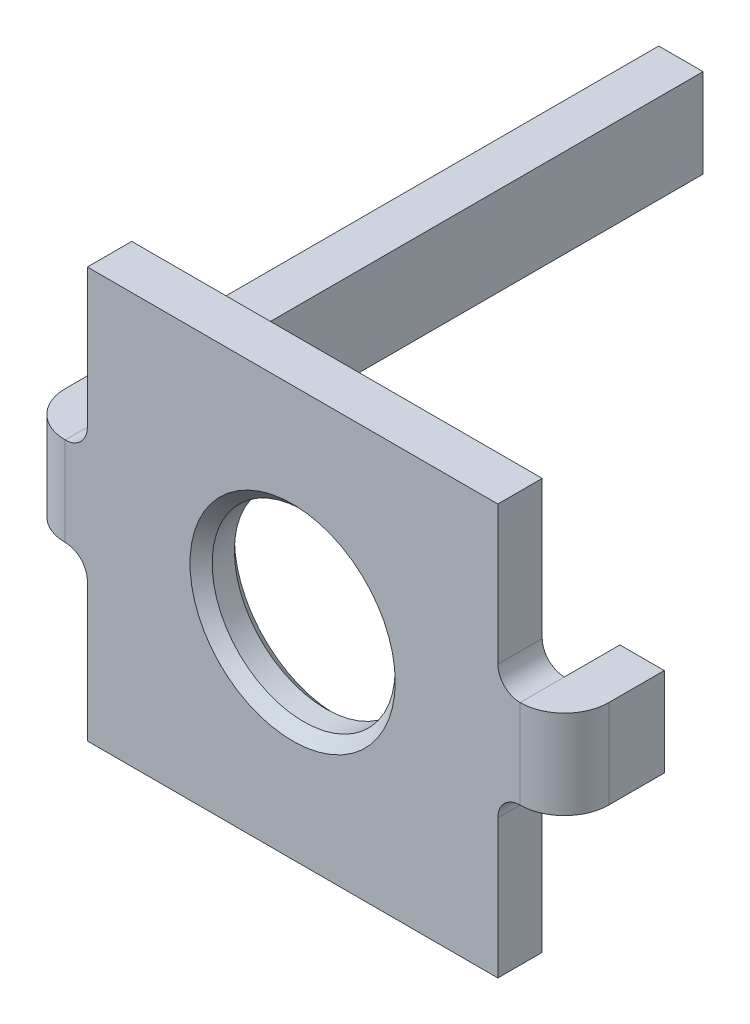
ISO-10303-21;
HEADER;
FILE_DESCRIPTION(('STEP AP214'),'2;1');
FILE_NAME('part.step','',(''),(''),'','','');
FILE_SCHEMA(('AUTOMOTIVE_DESIGN { 1 0 10303 214 1 1 1 1 }'));
ENDSEC;
DATA;
#1=APPLICATION_CONTEXT('core data for automotive mechanical design processes');
#2=APPLICATION_PROTOCOL_DEFINITION('international standard','automotive_design',2000,#1);
#3=PRODUCT_CONTEXT('',#1,'mechanical');
#4=PRODUCT('Part','Part','',(#3));
#5=PRODUCT_RELATED_PRODUCT_CATEGORY('part','',(#4));
#6=PRODUCT_DEFINITION_FORMATION('','',#4);
#7=PRODUCT_DEFINITION_CONTEXT('part definition',#1,'design');
#8=PRODUCT_DEFINITION('design','',#6,#7);
#9=PRODUCT_DEFINITION_SHAPE('','',#8);
#10=(LENGTH_UNIT() NAMED_UNIT(*) SI_UNIT(.MILLI.,.METRE.));
#11=(NAMED_UNIT(*) PLANE_ANGLE_UNIT() SI_UNIT($,.RADIAN.));
#12=(NAMED_UNIT(*) SI_UNIT($,.STERADIAN.) SOLID_ANGLE_UNIT());
#13=UNCERTAINTY_MEASURE_WITH_UNIT(LENGTH_MEASURE(1.E-05),#10,'distance_accuracy_value','');
#14=(GEOMETRIC_REPRESENTATION_CONTEXT(3) GLOBAL_UNCERTAINTY_ASSIGNED_CONTEXT((#13)) GLOBAL_UNIT_ASSIGNED_CONTEXT((#10,
#11,#12)) REPRESENTATION_CONTEXT('',''));
#15=CARTESIAN_POINT('',(0.,0.,0.));
#16=DIRECTION('',(0.,0.,1.));
#17=DIRECTION('',(1.,0.,0.));
#18=AXIS2_PLACEMENT_3D('',#15,#16,#17);
#19=CARTESIAN_POINT('',(85.200000000002,14.205,-2.2));
#20=DIRECTION('',(0.,0.,-1.));
#21=DIRECTION('',(0.,1.,0.));
#22=AXIS2_PLACEMENT_3D('',#19,#20,#21);
#23=PLANE('',#22);
#24=DIRECTION('',(1.,0.,0.));
#25=VECTOR('',#24,1.);
#26=CARTESIAN_POINT('',(84.399999999999,9.7050000000019,-2.2000000000002));
#27=LINE('',#26,#25);
#28=CARTESIAN_POINT('',(84.400000000002,9.70500000000063,-2.20000000000007));
#29=VERTEX_POINT('',#28);
#30=CARTESIAN_POINT('',(85.2000000000015,9.70500000000095,-2.20000000000015));
#31=VERTEX_POINT('',#30);
#32=EDGE_CURVE('E152',#29,#31,#27,.T.);
#33=ORIENTED_EDGE('',*,*,#32,.F.);
#34=DIRECTION('',(0.,1.,0.));
#35=VECTOR('',#34,1.);
#36=CARTESIAN_POINT('',(84.400000000002,14.205,-2.2));
#37=LINE('',#36,#35);
#38=CARTESIAN_POINT('',(84.4000000000013,11.3050000000013,-2.20000000000007));
#39=VERTEX_POINT('',#38);
#40=EDGE_CURVE('E198',#39,#29,#37,.F.);
#41=ORIENTED_EDGE('',*,*,#40,.F.);
#42=DIRECTION('',(1.,0.,0.));
#43=VECTOR('',#42,1.);
#44=CARTESIAN_POINT('',(85.200000000002,11.305,-2.2));
#45=LINE('',#44,#43);
#46=CARTESIAN_POINT('',(85.2000000000013,11.3050000000008,-2.20000000000007));
#47=VERTEX_POINT('',#46);
#48=EDGE_CURVE('E153',#39,#47,#45,.T.);
#49=ORIENTED_EDGE('',*,*,#48,.T.);
#50=DIRECTION('',(0.,1.,0.));
#51=VECTOR('',#50,1.);
#52=CARTESIAN_POINT('',(85.200000000002,14.205,-2.2));
#53=LINE('',#52,#51);
#54=EDGE_CURVE('E193',#31,#47,#53,.T.);
#55=ORIENTED_EDGE('',*,*,#54,.F.);
#56=EDGE_LOOP('',(#33,#41,#49,#55));
#57=FACE_BOUND('',#56,.T.);
#58=ADVANCED_FACE('F17',(#57),#23,.T.);
#59=CARTESIAN_POINT('',(84.399999999999,9.705000000003,5008.5));
#60=DIRECTION('',(0.,-1.,0.));
#61=DIRECTION('',(0.,0.,-1.));
#62=AXIS2_PLACEMENT_3D('',#59,#60,#61);
#63=PLANE('',#62);
#64=DIRECTION('',(0.,0.,-1.));
#65=VECTOR('',#64,1.);
#66=CARTESIAN_POINT('',(85.200000000002,9.705,8.5));
#67=LINE('',#66,#65);
#68=CARTESIAN_POINT('',(85.2000000000015,9.70500000000095,8.49999999999986));
#69=VERTEX_POINT('',#68);
#70=EDGE_CURVE('E177',#69,#31,#67,.T.);
#71=ORIENTED_EDGE('',*,*,#70,.F.);
#72=DIRECTION('',(0.,0.,-1.));
#73=VECTOR('',#72,1.);
#74=CARTESIAN_POINT('',(85.200000000001,9.705000000003,5008.5));
#75=LINE('',#74,#73);
#76=CARTESIAN_POINT('',(85.200000000001,9.70500000000095,9.29999999999982));
#77=VERTEX_POINT('',#76);
#78=EDGE_CURVE('E159',#69,#77,#75,.F.);
#79=ORIENTED_EDGE('',*,*,#78,.T.);
#80=CARTESIAN_POINT('',(85.200000000002,9.705,8.5));
#81=DIRECTION('',(0.,1.,0.));
#82=DIRECTION('',(0.,0.,1.));
#83=AXIS2_PLACEMENT_3D('',#80,#81,#82);
#84=CIRCLE('',#83,0.8);
#85=CARTESIAN_POINT('',(84.400000000002,9.705,8.5));
#86=VERTEX_POINT('',#85);
#87=EDGE_CURVE('E20',#77,#86,#84,.F.);
#88=ORIENTED_EDGE('',*,*,#87,.T.);
#89=DIRECTION('',(0.,0.,1.));
#90=VECTOR('',#89,1.);
#91=CARTESIAN_POINT('',(84.400000000002,9.705,-2.2));
#92=LINE('',#91,#90);
#93=EDGE_CURVE('E262',#29,#86,#92,.T.);
#94=ORIENTED_EDGE('',*,*,#93,.F.);
#95=ORIENTED_EDGE('',*,*,#32,.T.);
#96=EDGE_LOOP('',(#71,#79,#88,#94,#95));
#97=FACE_BOUND('',#96,.T.);
#98=ADVANCED_FACE('F175',(#97),#63,.T.);
#99=CARTESIAN_POINT('',(85.200000000002,14.205,8.5));
#100=DIRECTION('',(1.,0.,0.));
#101=DIRECTION('',(0.,0.,-1.));
#102=AXIS2_PLACEMENT_3D('',#99,#100,#101);
#103=PLANE('',#102);
#104=ORIENTED_EDGE('',*,*,#70,.T.);
#105=ORIENTED_EDGE('',*,*,#54,.T.);
#106=DIRECTION('',(0.,0.,1.));
#107=VECTOR('',#106,1.);
#108=CARTESIAN_POINT('',(85.200000000001,11.305000000003,5008.5));
#109=LINE('',#108,#107);
#110=CARTESIAN_POINT('',(85.2000000000015,11.3050000000014,8.49999999999973));
#111=VERTEX_POINT('',#110);
#112=EDGE_CURVE('E248',#111,#47,#109,.F.);
#113=ORIENTED_EDGE('',*,*,#112,.F.);
#114=DIRECTION('',(0.,1.,0.));
#115=VECTOR('',#114,1.);
#116=CARTESIAN_POINT('',(85.200000000002,14.205,8.5));
#117=LINE('',#116,#115);
#118=EDGE_CURVE('E179',#111,#69,#117,.F.);
#119=ORIENTED_EDGE('',*,*,#118,.T.);
#120=EDGE_LOOP('',(#104,#105,#113,#119));
#121=FACE_BOUND('',#120,.T.);
#122=ADVANCED_FACE('F275',(#121),#103,.T.);
#123=CARTESIAN_POINT('',(84.400000000002,14.205,-2.2));
#124=DIRECTION('',(-1.,0.,0.));
#125=DIRECTION('',(0.,0.,1.));
#126=AXIS2_PLACEMENT_3D('',#123,#124,#125);
#127=PLANE('',#126);
#128=ORIENTED_EDGE('',*,*,#93,.T.);
#129=DIRECTION('',(0.,1.,0.));
#130=VECTOR('',#129,1.);
#131=CARTESIAN_POINT('',(84.400000000002,14.205,8.5));
#132=LINE('',#131,#130);
#133=CARTESIAN_POINT('',(84.4000000000018,11.305000000001,8.49999999999993));
#134=VERTEX_POINT('',#133);
#135=EDGE_CURVE('E147',#86,#134,#132,.T.);
#136=ORIENTED_EDGE('',*,*,#135,.T.);
#137=DIRECTION('',(0.,0.,1.));
#138=VECTOR('',#137,1.);
#139=CARTESIAN_POINT('',(84.400000000001,11.305000000003,5008.5));
#140=LINE('',#139,#138);
#141=EDGE_CURVE('E244',#39,#134,#140,.T.);
#142=ORIENTED_EDGE('',*,*,#141,.F.);
#143=ORIENTED_EDGE('',*,*,#40,.T.);
#144=EDGE_LOOP('',(#128,#136,#142,#143));
#145=FACE_BOUND('',#144,.T.);
#146=ADVANCED_FACE('F269',(#145),#127,.T.);
#147=CARTESIAN_POINT('',(85.199999999999,11.305000000003,5008.5));
#148=DIRECTION('',(0.,1.,0.));
#149=DIRECTION('',(0.,0.,1.));
#150=AXIS2_PLACEMENT_3D('',#147,#148,#149);
#151=PLANE('',#150);
#152=ORIENTED_EDGE('',*,*,#48,.F.);
#153=ORIENTED_EDGE('',*,*,#141,.T.);
#154=CARTESIAN_POINT('',(85.200000000002,11.305,8.5));
#155=DIRECTION('',(0.,1.,0.));
#156=DIRECTION('',(0.,0.,1.));
#157=AXIS2_PLACEMENT_3D('',#154,#155,#156);
#158=CIRCLE('',#157,0.8);
#159=CARTESIAN_POINT('',(85.200000000001,11.305000000001,9.29999999999982));
#160=VERTEX_POINT('',#159);
#161=EDGE_CURVE('E242',#160,#134,#158,.F.);
#162=ORIENTED_EDGE('',*,*,#161,.F.);
#163=DIRECTION('',(0.,0.,1.));
#164=VECTOR('',#163,1.);
#165=CARTESIAN_POINT('',(85.200000000001,11.305000000003,5008.5));
#166=LINE('',#165,#164);
#167=EDGE_CURVE('E253',#160,#111,#166,.F.);
#168=ORIENTED_EDGE('',*,*,#167,.T.);
#169=ORIENTED_EDGE('',*,*,#112,.T.);
#170=EDGE_LOOP('',(#152,#153,#162,#168,#169));
#171=FACE_BOUND('',#170,.T.);
#172=ADVANCED_FACE('F495',(#171),#151,.T.);
#173=CARTESIAN_POINT('',(94.199999999998,14.205,8.499999999998));
#174=DIRECTION('',(1.,0.,0.));
#175=DIRECTION('',(0.,0.,-1.));
#176=AXIS2_PLACEMENT_3D('',#173,#174,#175);
#177=PLANE('',#176);
#178=DIRECTION('',(0.,0.,-1.));
#179=VECTOR('',#178,1.);
#180=CARTESIAN_POINT('',(94.199999999999,9.705000000003,5008.5));
#181=LINE('',#180,#179);
#182=CARTESIAN_POINT('',(94.199999999999,9.70500000000127,7.49999999999775));
#183=VERTEX_POINT('',#182);
#184=CARTESIAN_POINT('',(94.1999999999987,9.70500000000095,8.49999999999899));
#185=VERTEX_POINT('',#184);
#186=EDGE_CURVE('E232',#183,#185,#181,.F.);
#187=ORIENTED_EDGE('',*,*,#186,.F.);
#188=DIRECTION('',(0.,1.,0.));
#189=VECTOR('',#188,1.);
#190=CARTESIAN_POINT('',(94.199999999999,14.205,7.499999999998));
#191=LINE('',#190,#189);
#192=CARTESIAN_POINT('',(94.199999999999,11.3050000000006,7.49999999999788));
#193=VERTEX_POINT('',#192);
#194=EDGE_CURVE('E237',#193,#183,#191,.F.);
#195=ORIENTED_EDGE('',*,*,#194,.F.);
#196=DIRECTION('',(0.,0.,1.));
#197=VECTOR('',#196,1.);
#198=CARTESIAN_POINT('',(94.199999999999,11.305000000003,5008.5));
#199=LINE('',#198,#197);
#200=CARTESIAN_POINT('',(94.1999999999987,11.305000000001,8.49999999999899));
#201=VERTEX_POINT('',#200);
#202=EDGE_CURVE('E240',#201,#193,#199,.F.);
#203=ORIENTED_EDGE('',*,*,#202,.F.);
#204=DIRECTION('',(0.,1.,0.));
#205=VECTOR('',#204,1.);
#206=CARTESIAN_POINT('',(94.199999999998,14.205,8.499999999998));
#207=LINE('',#206,#205);
#208=EDGE_CURVE('E243',#185,#201,#207,.T.);
#209=ORIENTED_EDGE('',*,*,#208,.F.);
#210=EDGE_LOOP('',(#187,#195,#203,#209));
#211=FACE_BOUND('',#210,.T.);
#212=ADVANCED_FACE('F410',(#211),#177,.T.);
#213=CARTESIAN_POINT('',(89.3,10.505,9.29999999993925));
#214=DIRECTION('',(0.,0.,1.));
#215=DIRECTION('',(1.,0.,0.));
#216=AXIS2_PLACEMENT_3D('',#213,#214,#215);
#217=CONICAL_SURFACE('',#216,1.84999999996706,0.78539816325534);
#218=CARTESIAN_POINT('',(89.3,10.505,9.29999999999609));
#219=DIRECTION('',(0.,0.,1.));
#220=DIRECTION('',(1.,0.,0.));
#221=AXIS2_PLACEMENT_3D('',#218,#219,#220);
#222=CIRCLE('',#221,1.8500000000239);
#223=CARTESIAN_POINT('',(91.1500000000239,10.505,9.29999999999608));
#224=VERTEX_POINT('',#223);
#225=EDGE_CURVE('E172',#224,#224,#222,.F.);
#226=ORIENTED_EDGE('',*,*,#225,.F.);
#227=EDGE_LOOP('',(#226));
#228=FACE_BOUND('',#227,.T.);
#229=CARTESIAN_POINT('',(89.3,10.505,9.1));
#230=DIRECTION('',(0.,0.,1.));
#231=DIRECTION('',(1.,0.,0.));
#232=AXIS2_PLACEMENT_3D('',#229,#230,#231);
#233=CIRCLE('',#232,1.65);
#234=CARTESIAN_POINT('',(90.95,10.505,9.1));
#235=VERTEX_POINT('',#234);
#236=EDGE_CURVE('E241',#235,#235,#233,.F.);
#237=ORIENTED_EDGE('',*,*,#236,.T.);
#238=EDGE_LOOP('',(#237));
#239=FACE_BOUND('',#238,.T.);
#240=ADVANCED_FACE('F489',(#228,#239),#217,.F.);
#241=CARTESIAN_POINT('',(85.200000000002,14.205,8.5));
#242=DIRECTION('',(0.,1.,0.));
#243=DIRECTION('',(0.,0.,1.));
#244=AXIS2_PLACEMENT_3D('',#241,#242,#243);
#245=CYLINDRICAL_SURFACE('',#244,0.8);
#246=DIRECTION('',(0.,-1.,0.));
#247=VECTOR('',#246,1.);
#248=CARTESIAN_POINT('',(85.200000000001,14.205,9.3));
#249=LINE('',#248,#247);
#250=EDGE_CURVE('E145',#160,#77,#249,.T.);
#251=ORIENTED_EDGE('',*,*,#250,.F.);
#252=ORIENTED_EDGE('',*,*,#161,.T.);
#253=ORIENTED_EDGE('',*,*,#135,.F.);
#254=ORIENTED_EDGE('',*,*,#87,.F.);
#255=EDGE_LOOP('',(#251,#252,#253,#254));
#256=FACE_BOUND('',#255,.T.);
#257=ADVANCED_FACE('F142',(#256),#245,.T.);
#258=CARTESIAN_POINT('',(93.399999999998,14.205,8.5));
#259=DIRECTION('',(0.,1.,0.));
#260=DIRECTION('',(0.,0.,1.));
#261=AXIS2_PLACEMENT_3D('',#258,#259,#260);
#262=CYLINDRICAL_SURFACE('',#261,0.8);
#263=ORIENTED_EDGE('',*,*,#208,.T.);
#264=CARTESIAN_POINT('',(93.399999999998,11.305,8.5));
#265=DIRECTION('',(0.,1.,0.));
#266=DIRECTION('',(0.,0.,1.));
#267=AXIS2_PLACEMENT_3D('',#264,#265,#266);
#268=CIRCLE('',#267,0.8);
#269=CARTESIAN_POINT('',(93.3999999999987,11.3050000000004,9.29999999999982));
#270=VERTEX_POINT('',#269);
#271=EDGE_CURVE('E238',#270,#201,#268,.T.);
#272=ORIENTED_EDGE('',*,*,#271,.F.);
#273=DIRECTION('',(0.,-1.,0.));
#274=VECTOR('',#273,1.);
#275=CARTESIAN_POINT('',(93.399999999999,14.205,9.3));
#276=LINE('',#275,#274);
#277=CARTESIAN_POINT('',(93.3999999999986,9.7050000000002,9.29999999999991));
#278=VERTEX_POINT('',#277);
#279=EDGE_CURVE('E171',#278,#270,#276,.F.);
#280=ORIENTED_EDGE('',*,*,#279,.F.);
#281=CARTESIAN_POINT('',(93.399999999998,9.705,8.5));
#282=DIRECTION('',(0.,1.,0.));
#283=DIRECTION('',(0.,0.,1.));
#284=AXIS2_PLACEMENT_3D('',#281,#282,#283);
#285=CIRCLE('',#284,0.8);
#286=EDGE_CURVE('E233',#185,#278,#285,.F.);
#287=ORIENTED_EDGE('',*,*,#286,.F.);
#288=EDGE_LOOP('',(#263,#272,#280,#287));
#289=FACE_BOUND('',#288,.T.);
#290=ADVANCED_FACE('F428',(#289),#262,.T.);
#291=CARTESIAN_POINT('',(89.3,10.505,9.3));
#292=DIRECTION('',(0.,0.,1.));
#293=DIRECTION('',(1.,0.,0.));
#294=AXIS2_PLACEMENT_3D('',#291,#292,#293);
#295=CYLINDRICAL_SURFACE('',#294,1.65);
#296=ORIENTED_EDGE('',*,*,#236,.F.);
#297=EDGE_LOOP('',(#296));
#298=FACE_BOUND('',#297,.T.);
#299=CARTESIAN_POINT('',(89.3,10.505,8.69999999997617));
#300=DIRECTION('',(0.,0.,-1.));
#301=DIRECTION('',(0.,-1.,0.));
#302=AXIS2_PLACEMENT_3D('',#299,#300,#301);
#303=CIRCLE('',#302,1.65000000001726);
#304=CARTESIAN_POINT('',(89.3,8.85499999998274,8.69999999997617));
#305=VERTEX_POINT('',#304);
#306=EDGE_CURVE('E229',#305,#305,#303,.T.);
#307=ORIENTED_EDGE('',*,*,#306,.T.);
#308=EDGE_LOOP('',(#307));
#309=FACE_BOUND('',#308,.T.);
#310=ADVANCED_FACE('F481',(#298,#309),#295,.F.);
#311=CARTESIAN_POINT('',(94.199999999999,11.305000000003,5008.5));
#312=DIRECTION('',(0.,1.,0.));
#313=DIRECTION('',(0.,0.,1.));
#314=AXIS2_PLACEMENT_3D('',#311,#312,#313);
#315=PLANE('',#314);
#316=DIRECTION('',(0.,0.,1.));
#317=VECTOR('',#316,1.);
#318=CARTESIAN_POINT('',(93.399999999998,11.305,7.499999999998));
#319=LINE('',#318,#317);
#320=CARTESIAN_POINT('',(93.3999999999985,11.3050000000004,8.49999999999986));
#321=VERTEX_POINT('',#320);
#322=CARTESIAN_POINT('',(93.399999999998,11.305,7.499999999998));
#323=VERTEX_POINT('',#322);
#324=EDGE_CURVE('E343',#321,#323,#319,.F.);
#325=ORIENTED_EDGE('',*,*,#324,.F.);
#326=DIRECTION('',(0.,0.,1.));
#327=VECTOR('',#326,1.);
#328=CARTESIAN_POINT('',(93.399999999999,11.305000000003,5008.5));
#329=LINE('',#328,#327);
#330=EDGE_CURVE('E228',#321,#270,#329,.T.);
#331=ORIENTED_EDGE('',*,*,#330,.T.);
#332=ORIENTED_EDGE('',*,*,#271,.T.);
#333=ORIENTED_EDGE('',*,*,#202,.T.);
#334=DIRECTION('',(1.,0.,0.));
#335=VECTOR('',#334,1.);
#336=CARTESIAN_POINT('',(94.199999999998,11.305,7.499999999998));
#337=LINE('',#336,#335);
#338=EDGE_CURVE('E389',#323,#193,#337,.T.);
#339=ORIENTED_EDGE('',*,*,#338,.F.);
#340=EDGE_LOOP('',(#325,#331,#332,#333,#339));
#341=FACE_BOUND('',#340,.T.);
#342=ADVANCED_FACE('F421',(#341),#315,.T.);
#343=CARTESIAN_POINT('',(94.199999999998,14.205,7.499999999998));
#344=DIRECTION('',(0.,0.,-1.));
#345=DIRECTION('',(0.,1.,0.));
#346=AXIS2_PLACEMENT_3D('',#343,#344,#345);
#347=PLANE('',#346);
#348=DIRECTION('',(1.,0.,0.));
#349=VECTOR('',#348,1.);
#350=CARTESIAN_POINT('',(93.399999999999,9.7050000000019,7.49999999999762));
#351=LINE('',#350,#349);
#352=CARTESIAN_POINT('',(93.399999999998,9.70500000000063,7.49999999999787));
#353=VERTEX_POINT('',#352);
#354=EDGE_CURVE('E236',#353,#183,#351,.T.);
#355=ORIENTED_EDGE('',*,*,#354,.F.);
#356=DIRECTION('',(0.,1.,0.));
#357=VECTOR('',#356,1.);
#358=CARTESIAN_POINT('',(93.399999999998,14.205,7.499999999998));
#359=LINE('',#358,#357);
#360=EDGE_CURVE('E346',#323,#353,#359,.F.);
#361=ORIENTED_EDGE('',*,*,#360,.F.);
#362=ORIENTED_EDGE('',*,*,#338,.T.);
#363=ORIENTED_EDGE('',*,*,#194,.T.);
#364=EDGE_LOOP('',(#355,#361,#362,#363));
#365=FACE_BOUND('',#364,.T.);
#366=ADVANCED_FACE('F405',(#365),#347,.T.);
#367=CARTESIAN_POINT('',(93.399999999999,9.705000000003,5008.5));
#368=DIRECTION('',(0.,-1.,0.));
#369=DIRECTION('',(0.,0.,-1.));
#370=AXIS2_PLACEMENT_3D('',#367,#368,#369);
#371=PLANE('',#370);
#372=ORIENTED_EDGE('',*,*,#354,.T.);
#373=ORIENTED_EDGE('',*,*,#186,.T.);
#374=ORIENTED_EDGE('',*,*,#286,.T.);
#375=DIRECTION('',(0.,0.,1.));
#376=VECTOR('',#375,1.);
#377=CARTESIAN_POINT('',(93.3999999999996,9.705000000003,5008.5));
#378=LINE('',#377,#376);
#379=CARTESIAN_POINT('',(93.3999999999985,9.7050000000004,8.4999999999998));
#380=VERTEX_POINT('',#379);
#381=EDGE_CURVE('E224',#278,#380,#378,.F.);
#382=ORIENTED_EDGE('',*,*,#381,.T.);
#383=DIRECTION('',(0.,0.,1.));
#384=VECTOR('',#383,1.);
#385=CARTESIAN_POINT('',(93.399999999998,9.705,7.499999999998));
#386=LINE('',#385,#384);
#387=EDGE_CURVE('E225',#353,#380,#386,.T.);
#388=ORIENTED_EDGE('',*,*,#387,.F.);
#389=EDGE_LOOP('',(#372,#373,#374,#382,#388));
#390=FACE_BOUND('',#389,.T.);
#391=ADVANCED_FACE('F413',(#390),#371,.T.);
#392=CARTESIAN_POINT('',(85.200000000002,14.205,9.3));
#393=DIRECTION('',(0.,0.,1.));
#394=DIRECTION('',(0.,-1.,0.));
#395=AXIS2_PLACEMENT_3D('',#392,#393,#394);
#396=PLANE('',#395);
#397=DIRECTION('',(-1.,0.,0.));
#398=VECTOR('',#397,1.);
#399=CARTESIAN_POINT('',(87.310694525962,14.205,9.3));
#400=LINE('',#399,#398);
#401=CARTESIAN_POINT('',(85.5999999999991,14.205,9.29999999999988));
#402=VERTEX_POINT('',#401);
#403=CARTESIAN_POINT('',(92.9999999999974,14.205,9.29999999999976));
#404=VERTEX_POINT('',#403);
#405=EDGE_CURVE('E320',#402,#404,#400,.F.);
#406=ORIENTED_EDGE('',*,*,#405,.F.);
#407=DIRECTION('',(0.,-1.,0.));
#408=VECTOR('',#407,1.);
#409=CARTESIAN_POINT('',(85.5999999999974,14.205000000003,9.29999999999964));
#410=LINE('',#409,#408);
#411=CARTESIAN_POINT('',(85.5999999999974,11.7050000000004,9.29999999999964));
#412=VERTEX_POINT('',#411);
#413=EDGE_CURVE('E219',#412,#402,#410,.F.);
#414=ORIENTED_EDGE('',*,*,#413,.F.);
#415=CARTESIAN_POINT('',(85.1999999999984,11.7050000000008,9.29999999999964));
#416=DIRECTION('',(0.,0.,1.));
#417=DIRECTION('',(0.,-1.,0.));
#418=AXIS2_PLACEMENT_3D('',#415,#416,#417);
#419=CIRCLE('',#418,0.4);
#420=EDGE_CURVE('E170',#412,#160,#419,.F.);
#421=ORIENTED_EDGE('',*,*,#420,.T.);
#422=ORIENTED_EDGE('',*,*,#250,.T.);
#423=CARTESIAN_POINT('',(85.1999999999984,9.3050000000008,9.29999999999964));
#424=DIRECTION('',(0.,0.,1.));
#425=DIRECTION('',(0.,-1.,0.));
#426=AXIS2_PLACEMENT_3D('',#423,#424,#425);
#427=CIRCLE('',#426,0.4);
#428=CARTESIAN_POINT('',(85.5999999999979,9.3050000000004,9.29999999999964));
#429=VERTEX_POINT('',#428);
#430=EDGE_CURVE('E156',#77,#429,#427,.F.);
#431=ORIENTED_EDGE('',*,*,#430,.T.);
#432=DIRECTION('',(0.,-1.,0.));
#433=VECTOR('',#432,1.);
#434=CARTESIAN_POINT('',(85.5999999999974,9.305000000003,9.29999999999964));
#435=LINE('',#434,#433);
#436=CARTESIAN_POINT('',(85.5999999999974,6.805,9.29999999999976));
#437=VERTEX_POINT('',#436);
#438=EDGE_CURVE('E326',#437,#429,#435,.F.);
#439=ORIENTED_EDGE('',*,*,#438,.F.);
#440=DIRECTION('',(-1.,0.,0.));
#441=VECTOR('',#440,1.);
#442=CARTESIAN_POINT('',(87.310694525962,6.805,9.3));
#443=LINE('',#442,#441);
#444=CARTESIAN_POINT('',(92.9999999999991,6.805,9.29999999999988));
#445=VERTEX_POINT('',#444);
#446=EDGE_CURVE('E335',#437,#445,#443,.F.);
#447=ORIENTED_EDGE('',*,*,#446,.T.);
#448=DIRECTION('',(0.,1.,0.));
#449=VECTOR('',#448,1.);
#450=CARTESIAN_POINT('',(92.9999999999974,6.805000000003,9.29999999999964));
#451=LINE('',#450,#449);
#452=CARTESIAN_POINT('',(92.9999999999974,9.3050000000004,9.29999999999964));
#453=VERTEX_POINT('',#452);
#454=EDGE_CURVE('E341',#453,#445,#451,.F.);
#455=ORIENTED_EDGE('',*,*,#454,.F.);
#456=CARTESIAN_POINT('',(93.3999999999984,9.3050000000008,9.29999999999964));
#457=DIRECTION('',(0.,0.,1.));
#458=DIRECTION('',(0.,-1.,0.));
#459=AXIS2_PLACEMENT_3D('',#456,#457,#458);
#460=CIRCLE('',#459,0.4);
#461=EDGE_CURVE('E221',#453,#278,#460,.F.);
#462=ORIENTED_EDGE('',*,*,#461,.T.);
#463=ORIENTED_EDGE('',*,*,#279,.T.);
#464=CARTESIAN_POINT('',(93.3999999999984,11.7050000000008,9.29999999999964));
#465=DIRECTION('',(0.,0.,1.));
#466=DIRECTION('',(0.,-1.,0.));
#467=AXIS2_PLACEMENT_3D('',#464,#465,#466);
#468=CIRCLE('',#467,0.4);
#469=CARTESIAN_POINT('',(92.9999999999974,11.7050000000004,9.29999999999964));
#470=VERTEX_POINT('',#469);
#471=EDGE_CURVE('E226',#270,#470,#468,.F.);
#472=ORIENTED_EDGE('',*,*,#471,.T.);
#473=DIRECTION('',(0.,1.,0.));
#474=VECTOR('',#473,1.);
#475=CARTESIAN_POINT('',(92.9999999999974,11.705000000003,9.29999999999964));
#476=LINE('',#475,#474);
#477=EDGE_CURVE('E313',#404,#470,#476,.F.);
#478=ORIENTED_EDGE('',*,*,#477,.F.);
#479=EDGE_LOOP('',(#406,#414,#421,#422,#431,#439,#447,#455,#462,#463,#472,#478));
#480=FACE_BOUND('',#479,.T.);
#481=ORIENTED_EDGE('',*,*,#225,.T.);
#482=EDGE_LOOP('',(#481));
#483=FACE_BOUND('',#482,.T.);
#484=ADVANCED_FACE('F167',(#480,#483),#396,.T.);
#485=CARTESIAN_POINT('',(89.3,10.505,8.50000000008322));
#486=DIRECTION('',(0.,0.,-1.));
#487=DIRECTION('',(-1.,0.,0.));
#488=AXIS2_PLACEMENT_3D('',#485,#486,#487);
#489=CONICAL_SURFACE('',#488,1.84999999991022,0.78539816325534);
#490=CARTESIAN_POINT('',(89.3,10.505,8.49999999996953));
#491=DIRECTION('',(0.,0.,-1.));
#492=DIRECTION('',(-1.,0.,0.));
#493=AXIS2_PLACEMENT_3D('',#490,#491,#492);
#494=CIRCLE('',#493,1.8500000000239);
#495=CARTESIAN_POINT('',(87.4499999999761,10.505,8.49999999996953));
#496=VERTEX_POINT('',#495);
#497=EDGE_CURVE('E216',#496,#496,#494,.F.);
#498=ORIENTED_EDGE('',*,*,#497,.F.);
#499=EDGE_LOOP('',(#498));
#500=FACE_BOUND('',#499,.T.);
#501=ORIENTED_EDGE('',*,*,#306,.F.);
#502=EDGE_LOOP('',(#501));
#503=FACE_BOUND('',#502,.T.);
#504=ADVANCED_FACE('F469',(#500,#503),#489,.F.);
#505=CARTESIAN_POINT('',(93.399999999999,11.705000000003,5008.5));
#506=DIRECTION('',(0.,0.,1.));
#507=DIRECTION('',(0.,-1.,0.));
#508=AXIS2_PLACEMENT_3D('',#505,#506,#507);
#509=CYLINDRICAL_SURFACE('',#508,0.4);
#510=CARTESIAN_POINT('',(93.3999999999984,11.7050000000008,8.49999999999973));
#511=DIRECTION('',(0.,0.,1.));
#512=DIRECTION('',(0.,-1.,0.));
#513=AXIS2_PLACEMENT_3D('',#510,#511,#512);
#514=CIRCLE('',#513,0.4);
#515=CARTESIAN_POINT('',(92.9999999999987,11.7050000000004,8.49999999999973));
#516=VERTEX_POINT('',#515);
#517=EDGE_CURVE('E213',#516,#321,#514,.T.);
#518=ORIENTED_EDGE('',*,*,#517,.F.);
#519=DIRECTION('',(0.,0.,1.));
#520=VECTOR('',#519,1.);
#521=CARTESIAN_POINT('',(92.999999999999,11.705,5008.5));
#522=LINE('',#521,#520);
#523=EDGE_CURVE('E310',#470,#516,#522,.F.);
#524=ORIENTED_EDGE('',*,*,#523,.F.);
#525=ORIENTED_EDGE('',*,*,#471,.F.);
#526=ORIENTED_EDGE('',*,*,#330,.F.);
#527=EDGE_LOOP('',(#518,#524,#525,#526));
#528=FACE_BOUND('',#527,.T.);
#529=ADVANCED_FACE('F424',(#528),#509,.F.);
#530=CARTESIAN_POINT('',(93.399999999998,14.205,7.499999999998));
#531=DIRECTION('',(-1.,0.,0.));
#532=DIRECTION('',(0.,0.,1.));
#533=AXIS2_PLACEMENT_3D('',#530,#531,#532);
#534=PLANE('',#533);
#535=ORIENTED_EDGE('',*,*,#387,.T.);
#536=DIRECTION('',(0.,1.,0.));
#537=VECTOR('',#536,1.);
#538=CARTESIAN_POINT('',(93.399999999999,14.205,8.5));
#539=LINE('',#538,#537);
#540=EDGE_CURVE('E212',#321,#380,#539,.F.);
#541=ORIENTED_EDGE('',*,*,#540,.F.);
#542=ORIENTED_EDGE('',*,*,#324,.T.);
#543=ORIENTED_EDGE('',*,*,#360,.T.);
#544=EDGE_LOOP('',(#535,#541,#542,#543));
#545=FACE_BOUND('',#544,.T.);
#546=ADVANCED_FACE('F418',(#545),#534,.T.);
#547=CARTESIAN_POINT('',(93.399999999999,9.305000000003,5008.5));
#548=DIRECTION('',(0.,0.,1.));
#549=DIRECTION('',(0.,-1.,0.));
#550=AXIS2_PLACEMENT_3D('',#547,#548,#549);
#551=CYLINDRICAL_SURFACE('',#550,0.4);
#552=CARTESIAN_POINT('',(93.3999999999984,9.3050000000008,8.49999999999973));
#553=DIRECTION('',(0.,0.,1.));
#554=DIRECTION('',(0.,-1.,0.));
#555=AXIS2_PLACEMENT_3D('',#552,#553,#554);
#556=CIRCLE('',#555,0.4);
#557=CARTESIAN_POINT('',(92.9999999999987,9.3050000000004,8.49999999999973));
#558=VERTEX_POINT('',#557);
#559=EDGE_CURVE('E208',#380,#558,#556,.T.);
#560=ORIENTED_EDGE('',*,*,#559,.F.);
#561=ORIENTED_EDGE('',*,*,#381,.F.);
#562=ORIENTED_EDGE('',*,*,#461,.F.);
#563=DIRECTION('',(0.,0.,1.));
#564=VECTOR('',#563,1.);
#565=CARTESIAN_POINT('',(92.999999999999,9.305,5008.5));
#566=LINE('',#565,#564);
#567=EDGE_CURVE('E338',#558,#453,#566,.T.);
#568=ORIENTED_EDGE('',*,*,#567,.F.);
#569=EDGE_LOOP('',(#560,#561,#562,#568));
#570=FACE_BOUND('',#569,.T.);
#571=ADVANCED_FACE('F430',(#570),#551,.F.);
#572=CARTESIAN_POINT('',(92.999999999999,6.805000000003,5008.5));
#573=DIRECTION('',(1.,0.,0.));
#574=DIRECTION('',(0.,1.,0.));
#575=AXIS2_PLACEMENT_3D('',#572,#573,#574);
#576=PLANE('',#575);
#577=DIRECTION('',(0.,1.,0.));
#578=VECTOR('',#577,1.);
#579=CARTESIAN_POINT('',(93.,14.205,8.5));
#580=LINE('',#579,#578);
#581=CARTESIAN_POINT('',(93.,6.805,8.50000000000001));
#582=VERTEX_POINT('',#581);
#583=EDGE_CURVE('E211',#558,#582,#580,.F.);
#584=ORIENTED_EDGE('',*,*,#583,.F.);
#585=ORIENTED_EDGE('',*,*,#567,.T.);
#586=ORIENTED_EDGE('',*,*,#454,.T.);
#587=DIRECTION('',(0.,0.,1.));
#588=VECTOR('',#587,1.);
#589=CARTESIAN_POINT('',(93.,6.805,5.83269877479));
#590=LINE('',#589,#588);
#591=EDGE_CURVE('E333',#445,#582,#590,.F.);
#592=ORIENTED_EDGE('',*,*,#591,.T.);
#593=EDGE_LOOP('',(#584,#585,#586,#592));
#594=FACE_BOUND('',#593,.T.);
#595=ADVANCED_FACE('F458',(#594),#576,.T.);
#596=CARTESIAN_POINT('',(87.310694525962,6.805,5.83269877479));
#597=DIRECTION('',(0.,1.,0.));
#598=DIRECTION('',(-1.,0.,0.));
#599=AXIS2_PLACEMENT_3D('',#596,#597,#598);
#600=PLANE('',#599);
#601=ORIENTED_EDGE('',*,*,#591,.F.);
#602=ORIENTED_EDGE('',*,*,#446,.F.);
#603=DIRECTION('',(0.,0.,1.));
#604=VECTOR('',#603,1.);
#605=CARTESIAN_POINT('',(85.599999999999,6.805,5008.5));
#606=LINE('',#605,#604);
#607=CARTESIAN_POINT('',(85.5999999999991,6.805,8.49999999999991));
#608=VERTEX_POINT('',#607);
#609=EDGE_CURVE('E164',#608,#437,#606,.T.);
#610=ORIENTED_EDGE('',*,*,#609,.F.);
#611=DIRECTION('',(1.,0.,0.));
#612=VECTOR('',#611,1.);
#613=CARTESIAN_POINT('',(93.399999999998,6.805,8.50000000000001));
#614=LINE('',#613,#612);
#615=EDGE_CURVE('E301',#582,#608,#614,.F.);
#616=ORIENTED_EDGE('',*,*,#615,.F.);
#617=EDGE_LOOP('',(#601,#602,#610,#616));
#618=FACE_BOUND('',#617,.T.);
#619=ADVANCED_FACE('F454',(#618),#600,.F.);
#620=CARTESIAN_POINT('',(85.599999999999,9.305000000003,5008.5));
#621=DIRECTION('',(-1.,0.,0.));
#622=DIRECTION('',(0.,-1.,0.));
#623=AXIS2_PLACEMENT_3D('',#620,#621,#622);
#624=PLANE('',#623);
#625=DIRECTION('',(0.,1.,0.));
#626=VECTOR('',#625,1.);
#627=CARTESIAN_POINT('',(85.6,14.205,8.5));
#628=LINE('',#627,#626);
#629=CARTESIAN_POINT('',(85.5999999999992,9.3050000000004,8.49999999999973));
#630=VERTEX_POINT('',#629);
#631=EDGE_CURVE('E207',#608,#630,#628,.T.);
#632=ORIENTED_EDGE('',*,*,#631,.F.);
#633=ORIENTED_EDGE('',*,*,#609,.T.);
#634=ORIENTED_EDGE('',*,*,#438,.T.);
#635=DIRECTION('',(0.,0.,1.));
#636=VECTOR('',#635,1.);
#637=CARTESIAN_POINT('',(85.599999999999,9.3050000000022,5008.5));
#638=LINE('',#637,#636);
#639=EDGE_CURVE('E161',#429,#630,#638,.F.);
#640=ORIENTED_EDGE('',*,*,#639,.T.);
#641=EDGE_LOOP('',(#632,#633,#634,#640));
#642=FACE_BOUND('',#641,.T.);
#643=ADVANCED_FACE('F451',(#642),#624,.T.);
#644=CARTESIAN_POINT('',(85.199999999999,9.305000000003,5008.5));
#645=DIRECTION('',(0.,0.,1.));
#646=DIRECTION('',(0.,-1.,0.));
#647=AXIS2_PLACEMENT_3D('',#644,#645,#646);
#648=CYLINDRICAL_SURFACE('',#647,0.4);
#649=CARTESIAN_POINT('',(85.1999999999984,9.3050000000008,8.49999999999973));
#650=DIRECTION('',(0.,0.,1.));
#651=DIRECTION('',(0.,-1.,0.));
#652=AXIS2_PLACEMENT_3D('',#649,#650,#651);
#653=CIRCLE('',#652,0.4);
#654=EDGE_CURVE('E205',#630,#69,#653,.T.);
#655=ORIENTED_EDGE('',*,*,#654,.F.);
#656=ORIENTED_EDGE('',*,*,#639,.F.);
#657=ORIENTED_EDGE('',*,*,#430,.F.);
#658=ORIENTED_EDGE('',*,*,#78,.F.);
#659=EDGE_LOOP('',(#655,#656,#657,#658));
#660=FACE_BOUND('',#659,.T.);
#661=ADVANCED_FACE('F158',(#660),#648,.F.);
#662=CARTESIAN_POINT('',(85.199999999999,11.705000000003,5008.5));
#663=DIRECTION('',(0.,0.,1.));
#664=DIRECTION('',(0.,-1.,0.));
#665=AXIS2_PLACEMENT_3D('',#662,#663,#664);
#666=CYLINDRICAL_SURFACE('',#665,0.4);
#667=CARTESIAN_POINT('',(85.1999999999984,11.7050000000008,8.49999999999973));
#668=DIRECTION('',(0.,0.,1.));
#669=DIRECTION('',(0.,-1.,0.));
#670=AXIS2_PLACEMENT_3D('',#667,#668,#669);
#671=CIRCLE('',#670,0.4);
#672=CARTESIAN_POINT('',(85.5999999999987,11.7050000000004,8.49999999999973));
#673=VERTEX_POINT('',#672);
#674=EDGE_CURVE('E201',#111,#673,#671,.T.);
#675=ORIENTED_EDGE('',*,*,#674,.F.);
#676=ORIENTED_EDGE('',*,*,#167,.F.);
#677=ORIENTED_EDGE('',*,*,#420,.F.);
#678=DIRECTION('',(0.,0.,1.));
#679=VECTOR('',#678,1.);
#680=CARTESIAN_POINT('',(85.599999999999,11.705,5008.5));
#681=LINE('',#680,#679);
#682=EDGE_CURVE('E286',#673,#412,#681,.T.);
#683=ORIENTED_EDGE('',*,*,#682,.F.);
#684=EDGE_LOOP('',(#675,#676,#677,#683));
#685=FACE_BOUND('',#684,.T.);
#686=ADVANCED_FACE('F284',(#685),#666,.F.);
#687=CARTESIAN_POINT('',(85.599999999999,14.205000000003,5008.5));
#688=DIRECTION('',(-1.,0.,0.));
#689=DIRECTION('',(0.,-1.,0.));
#690=AXIS2_PLACEMENT_3D('',#687,#688,#689);
#691=PLANE('',#690);
#692=DIRECTION('',(0.,1.,0.));
#693=VECTOR('',#692,1.);
#694=CARTESIAN_POINT('',(85.6,14.205,8.5));
#695=LINE('',#694,#693);
#696=CARTESIAN_POINT('',(85.6,14.205,8.5));
#697=VERTEX_POINT('',#696);
#698=EDGE_CURVE('E204',#673,#697,#695,.T.);
#699=ORIENTED_EDGE('',*,*,#698,.F.);
#700=ORIENTED_EDGE('',*,*,#682,.T.);
#701=ORIENTED_EDGE('',*,*,#413,.T.);
#702=DIRECTION('',(0.,0.,1.));
#703=VECTOR('',#702,1.);
#704=CARTESIAN_POINT('',(85.6,14.205,5.83269877479));
#705=LINE('',#704,#703);
#706=EDGE_CURVE('E289',#697,#402,#705,.T.);
#707=ORIENTED_EDGE('',*,*,#706,.F.);
#708=EDGE_LOOP('',(#699,#700,#701,#707));
#709=FACE_BOUND('',#708,.T.);
#710=ADVANCED_FACE('F291',(#709),#691,.T.);
#711=CARTESIAN_POINT('',(87.310694525962,14.205,5.83269877479));
#712=DIRECTION('',(0.,1.,0.));
#713=DIRECTION('',(-1.,0.,0.));
#714=AXIS2_PLACEMENT_3D('',#711,#712,#713);
#715=PLANE('',#714);
#716=DIRECTION('',(0.,0.,1.));
#717=VECTOR('',#716,1.);
#718=CARTESIAN_POINT('',(92.999999999999,14.205,5008.5));
#719=LINE('',#718,#717);
#720=CARTESIAN_POINT('',(92.9999999999991,14.205,8.49999999999991));
#721=VERTEX_POINT('',#720);
#722=EDGE_CURVE('E35',#721,#404,#719,.T.);
#723=ORIENTED_EDGE('',*,*,#722,.F.);
#724=DIRECTION('',(1.,0.,0.));
#725=VECTOR('',#724,1.);
#726=CARTESIAN_POINT('',(93.399999999998,14.205,8.5));
#727=LINE('',#726,#725);
#728=EDGE_CURVE('E26',#697,#721,#727,.T.);
#729=ORIENTED_EDGE('',*,*,#728,.F.);
#730=ORIENTED_EDGE('',*,*,#706,.T.);
#731=ORIENTED_EDGE('',*,*,#405,.T.);
#732=EDGE_LOOP('',(#723,#729,#730,#731));
#733=FACE_BOUND('',#732,.T.);
#734=ADVANCED_FACE('F435',(#733),#715,.T.);
#735=CARTESIAN_POINT('',(92.999999999999,11.705000000003,5008.5));
#736=DIRECTION('',(1.,0.,0.));
#737=DIRECTION('',(0.,1.,0.));
#738=AXIS2_PLACEMENT_3D('',#735,#736,#737);
#739=PLANE('',#738);
#740=DIRECTION('',(0.,1.,0.));
#741=VECTOR('',#740,1.);
#742=CARTESIAN_POINT('',(93.,14.205,8.5));
#743=LINE('',#742,#741);
#744=EDGE_CURVE('E11',#721,#516,#743,.F.);
#745=ORIENTED_EDGE('',*,*,#744,.F.);
#746=ORIENTED_EDGE('',*,*,#722,.T.);
#747=ORIENTED_EDGE('',*,*,#477,.T.);
#748=ORIENTED_EDGE('',*,*,#523,.T.);
#749=EDGE_LOOP('',(#745,#746,#747,#748));
#750=FACE_BOUND('',#749,.T.);
#751=ADVANCED_FACE('F433',(#750),#739,.T.);
#752=CARTESIAN_POINT('',(93.399999999998,14.205,8.5));
#753=DIRECTION('',(0.,0.,-1.));
#754=DIRECTION('',(0.,1.,0.));
#755=AXIS2_PLACEMENT_3D('',#752,#753,#754);
#756=PLANE('',#755);
#757=ORIENTED_EDGE('',*,*,#728,.T.);
#758=ORIENTED_EDGE('',*,*,#744,.T.);
#759=ORIENTED_EDGE('',*,*,#517,.T.);
#760=ORIENTED_EDGE('',*,*,#540,.T.);
#761=ORIENTED_EDGE('',*,*,#559,.T.);
#762=ORIENTED_EDGE('',*,*,#583,.T.);
#763=ORIENTED_EDGE('',*,*,#615,.T.);
#764=ORIENTED_EDGE('',*,*,#631,.T.);
#765=ORIENTED_EDGE('',*,*,#654,.T.);
#766=ORIENTED_EDGE('',*,*,#118,.F.);
#767=ORIENTED_EDGE('',*,*,#674,.T.);
#768=ORIENTED_EDGE('',*,*,#698,.T.);
#769=EDGE_LOOP('',(#757,#758,#759,#760,#761,#762,#763,#764,#765,#766,#767,#768));
#770=FACE_BOUND('',#769,.T.);
#771=ORIENTED_EDGE('',*,*,#497,.T.);
#772=EDGE_LOOP('',(#771));
#773=FACE_BOUND('',#772,.T.);
#774=ADVANCED_FACE('F279',(#770,#773),#756,.T.);
#775=CLOSED_SHELL('',(#58,#98,#122,#146,#172,#212,#240,#257,#290,#310,#342,#366,#391,#484,#504,
#529,#546,#571,#595,#619,#643,#661,#686,#710,#734,#751,#774));
#776=MANIFOLD_SOLID_BREP('B1',#775);
#777=ADVANCED_BREP_SHAPE_REPRESENTATION('',(#18,#776),#14);
#778=SHAPE_DEFINITION_REPRESENTATION(#9,#777);
ENDSEC;
END-ISO-10303-21;
